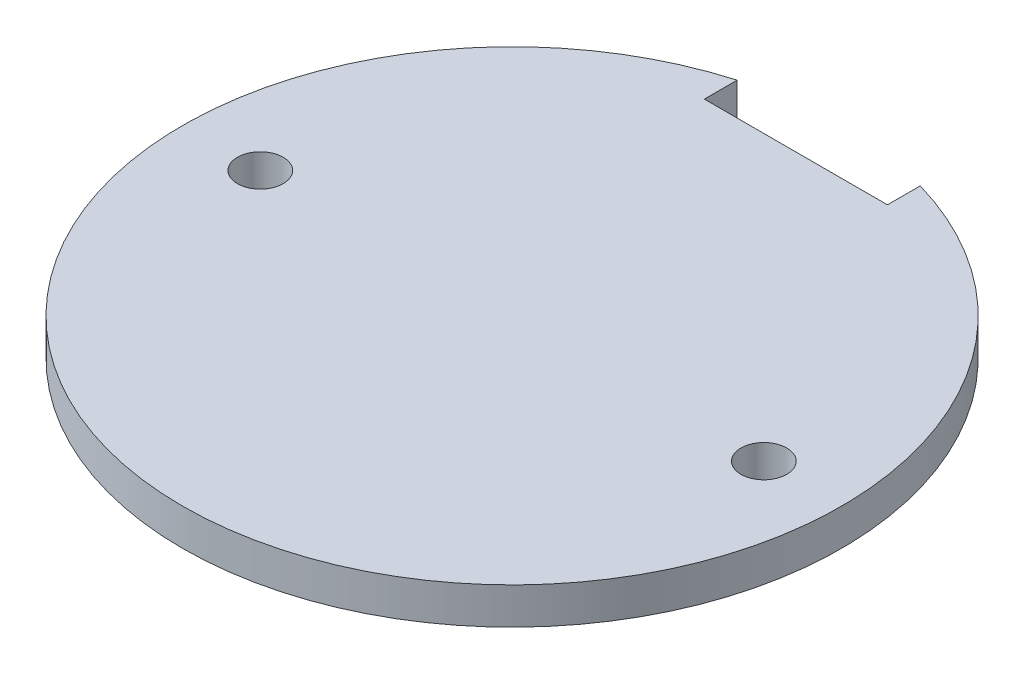
ISO-10303-21;
HEADER;
FILE_DESCRIPTION(('STEP AP214'),'2;1');
FILE_NAME('part.step','',(''),(''),'','','');
FILE_SCHEMA(('AUTOMOTIVE_DESIGN { 1 0 10303 214 1 1 1 1 }'));
ENDSEC;
DATA;
#1=APPLICATION_CONTEXT('core data for automotive mechanical design processes');
#2=APPLICATION_PROTOCOL_DEFINITION('international standard','automotive_design',2000,#1);
#3=PRODUCT_CONTEXT('',#1,'mechanical');
#4=PRODUCT('Part','Part','',(#3));
#5=PRODUCT_RELATED_PRODUCT_CATEGORY('part','',(#4));
#6=PRODUCT_DEFINITION_FORMATION('','',#4);
#7=PRODUCT_DEFINITION_CONTEXT('part definition',#1,'design');
#8=PRODUCT_DEFINITION('design','',#6,#7);
#9=PRODUCT_DEFINITION_SHAPE('','',#8);
#10=(LENGTH_UNIT() NAMED_UNIT(*) SI_UNIT(.MILLI.,.METRE.));
#11=(NAMED_UNIT(*) PLANE_ANGLE_UNIT() SI_UNIT($,.RADIAN.));
#12=(NAMED_UNIT(*) SI_UNIT($,.STERADIAN.) SOLID_ANGLE_UNIT());
#13=UNCERTAINTY_MEASURE_WITH_UNIT(LENGTH_MEASURE(1.E-05),#10,'distance_accuracy_value','');
#14=(GEOMETRIC_REPRESENTATION_CONTEXT(3) GLOBAL_UNCERTAINTY_ASSIGNED_CONTEXT((#13)) GLOBAL_UNIT_ASSIGNED_CONTEXT((#10,
#11,#12)) REPRESENTATION_CONTEXT('',''));
#15=CARTESIAN_POINT('',(0.,0.,0.));
#16=DIRECTION('',(0.,0.,1.));
#17=DIRECTION('',(1.,0.,0.));
#18=AXIS2_PLACEMENT_3D('',#15,#16,#17);
#19=CARTESIAN_POINT('',(0.,4.,0.));
#20=DIRECTION('',(0.,1.,0.));
#21=DIRECTION('',(0.,0.,1.));
#22=AXIS2_PLACEMENT_3D('',#19,#20,#21);
#23=PLANE('',#22);
#24=CARTESIAN_POINT('',(-27.5,4.,0.));
#25=DIRECTION('',(0.,1.,0.));
#26=DIRECTION('',(0.,0.,1.));
#27=AXIS2_PLACEMENT_3D('',#24,#25,#26);
#28=CIRCLE('',#27,2.5);
#29=CARTESIAN_POINT('',(-27.5,4.,2.5));
#30=VERTEX_POINT('',#29);
#31=EDGE_CURVE('E100',#30,#30,#28,.T.);
#32=ORIENTED_EDGE('',*,*,#31,.F.);
#33=EDGE_LOOP('',(#32));
#34=FACE_BOUND('',#33,.T.);
#35=CARTESIAN_POINT('',(0.,4.,0.));
#36=DIRECTION('',(0.,1.,0.));
#37=DIRECTION('',(0.,0.,1.));
#38=AXIS2_PLACEMENT_3D('',#35,#36,#37);
#39=CIRCLE('',#38,36.);
#40=CARTESIAN_POINT('',(-10.,4.,-34.5832329315812));
#41=VERTEX_POINT('',#40);
#42=CARTESIAN_POINT('',(10.,4.,-34.5832329315812));
#43=VERTEX_POINT('',#42);
#44=EDGE_CURVE('E85',#41,#43,#39,.T.);
#45=ORIENTED_EDGE('',*,*,#44,.T.);
#46=DIRECTION('',(0.,0.,1.));
#47=VECTOR('',#46,1.);
#48=CARTESIAN_POINT('',(10.,4.,-31.));
#49=LINE('',#48,#47);
#50=CARTESIAN_POINT('',(10.,4.,-31.));
#51=VERTEX_POINT('',#50);
#52=EDGE_CURVE('E80',#43,#51,#49,.T.);
#53=ORIENTED_EDGE('',*,*,#52,.T.);
#54=DIRECTION('',(-1.,0.,0.));
#55=VECTOR('',#54,1.);
#56=CARTESIAN_POINT('',(-10.,4.,-31.));
#57=LINE('',#56,#55);
#58=CARTESIAN_POINT('',(-10.,4.,-31.));
#59=VERTEX_POINT('',#58);
#60=EDGE_CURVE('E83',#51,#59,#57,.T.);
#61=ORIENTED_EDGE('',*,*,#60,.T.);
#62=DIRECTION('',(0.,0.,-1.));
#63=VECTOR('',#62,1.);
#64=CARTESIAN_POINT('',(-10.,4.,-34.5832329315812));
#65=LINE('',#64,#63);
#66=EDGE_CURVE('E50',#59,#41,#65,.T.);
#67=ORIENTED_EDGE('',*,*,#66,.T.);
#68=EDGE_LOOP('',(#45,#53,#61,#67));
#69=FACE_BOUND('',#68,.T.);
#70=CARTESIAN_POINT('',(27.5,4.,0.));
#71=DIRECTION('',(0.,1.,0.));
#72=DIRECTION('',(0.,0.,1.));
#73=AXIS2_PLACEMENT_3D('',#70,#71,#72);
#74=CIRCLE('',#73,2.5);
#75=CARTESIAN_POINT('',(27.5,4.,2.49999999999999));
#76=VERTEX_POINT('',#75);
#77=EDGE_CURVE('E115',#76,#76,#74,.T.);
#78=ORIENTED_EDGE('',*,*,#77,.F.);
#79=EDGE_LOOP('',(#78));
#80=FACE_BOUND('',#79,.T.);
#81=ADVANCED_FACE('F33',(#34,#69,#80),#23,.T.);
#82=CARTESIAN_POINT('',(0.,0.,0.));
#83=DIRECTION('',(0.,1.,0.));
#84=DIRECTION('',(0.,0.,1.));
#85=AXIS2_PLACEMENT_3D('',#82,#83,#84);
#86=PLANE('',#85);
#87=CARTESIAN_POINT('',(0.,0.,0.));
#88=DIRECTION('',(0.,1.,0.));
#89=DIRECTION('',(0.,0.,1.));
#90=AXIS2_PLACEMENT_3D('',#87,#88,#89);
#91=CIRCLE('',#90,36.);
#92=CARTESIAN_POINT('',(-10.,0.,-34.5832329315812));
#93=VERTEX_POINT('',#92);
#94=CARTESIAN_POINT('',(10.,0.,-34.5832329315812));
#95=VERTEX_POINT('',#94);
#96=EDGE_CURVE('E97',#93,#95,#91,.T.);
#97=ORIENTED_EDGE('',*,*,#96,.F.);
#98=DIRECTION('',(0.,0.,-1.));
#99=VECTOR('',#98,1.);
#100=CARTESIAN_POINT('',(-10.,0.,-34.5832329315812));
#101=LINE('',#100,#99);
#102=CARTESIAN_POINT('',(-10.,0.,-31.));
#103=VERTEX_POINT('',#102);
#104=EDGE_CURVE('E73',#103,#93,#101,.T.);
#105=ORIENTED_EDGE('',*,*,#104,.F.);
#106=DIRECTION('',(-1.,0.,0.));
#107=VECTOR('',#106,1.);
#108=CARTESIAN_POINT('',(-10.,0.,-31.));
#109=LINE('',#108,#107);
#110=CARTESIAN_POINT('',(10.,0.,-31.));
#111=VERTEX_POINT('',#110);
#112=EDGE_CURVE('E67',#111,#103,#109,.T.);
#113=ORIENTED_EDGE('',*,*,#112,.F.);
#114=DIRECTION('',(0.,0.,1.));
#115=VECTOR('',#114,1.);
#116=CARTESIAN_POINT('',(10.,0.,-31.));
#117=LINE('',#116,#115);
#118=EDGE_CURVE('E89',#95,#111,#117,.T.);
#119=ORIENTED_EDGE('',*,*,#118,.F.);
#120=EDGE_LOOP('',(#97,#105,#113,#119));
#121=FACE_BOUND('',#120,.T.);
#122=CARTESIAN_POINT('',(-27.5,0.,0.));
#123=DIRECTION('',(0.,1.,0.));
#124=DIRECTION('',(0.,0.,1.));
#125=AXIS2_PLACEMENT_3D('',#122,#123,#124);
#126=CIRCLE('',#125,2.5);
#127=CARTESIAN_POINT('',(-27.5,0.,2.5));
#128=VERTEX_POINT('',#127);
#129=EDGE_CURVE('E112',#128,#128,#126,.T.);
#130=ORIENTED_EDGE('',*,*,#129,.T.);
#131=EDGE_LOOP('',(#130));
#132=FACE_BOUND('',#131,.T.);
#133=CARTESIAN_POINT('',(27.5,0.,0.));
#134=DIRECTION('',(0.,1.,0.));
#135=DIRECTION('',(0.,0.,1.));
#136=AXIS2_PLACEMENT_3D('',#133,#134,#135);
#137=CIRCLE('',#136,2.5);
#138=CARTESIAN_POINT('',(27.5,0.,2.49999999999999));
#139=VERTEX_POINT('',#138);
#140=EDGE_CURVE('E118',#139,#139,#137,.T.);
#141=ORIENTED_EDGE('',*,*,#140,.T.);
#142=EDGE_LOOP('',(#141));
#143=FACE_BOUND('',#142,.T.);
#144=ADVANCED_FACE('F108',(#121,#132,#143),#86,.F.);
#145=CARTESIAN_POINT('',(0.,4.,0.));
#146=DIRECTION('',(0.,-1.,0.));
#147=DIRECTION('',(0.,0.,-1.));
#148=AXIS2_PLACEMENT_3D('',#145,#146,#147);
#149=CYLINDRICAL_SURFACE('',#148,36.);
#150=ORIENTED_EDGE('',*,*,#96,.T.);
#151=DIRECTION('',(0.,-1.,0.));
#152=VECTOR('',#151,1.);
#153=CARTESIAN_POINT('',(10.,4.,-34.5832329315812));
#154=LINE('',#153,#152);
#155=EDGE_CURVE('E11',#43,#95,#154,.T.);
#156=ORIENTED_EDGE('',*,*,#155,.F.);
#157=ORIENTED_EDGE('',*,*,#44,.F.);
#158=DIRECTION('',(0.,-1.,0.));
#159=VECTOR('',#158,1.);
#160=CARTESIAN_POINT('',(-10.,4.,-34.5832329315812));
#161=LINE('',#160,#159);
#162=EDGE_CURVE('E93',#41,#93,#161,.T.);
#163=ORIENTED_EDGE('',*,*,#162,.T.);
#164=EDGE_LOOP('',(#150,#156,#157,#163));
#165=FACE_BOUND('',#164,.T.);
#166=ADVANCED_FACE('F35',(#165),#149,.T.);
#167=CARTESIAN_POINT('',(10.,4.,-31.));
#168=DIRECTION('',(1.,0.,0.));
#169=DIRECTION('',(0.,0.,-1.));
#170=AXIS2_PLACEMENT_3D('',#167,#168,#169);
#171=PLANE('',#170);
#172=ORIENTED_EDGE('',*,*,#118,.T.);
#173=DIRECTION('',(0.,-1.,0.));
#174=VECTOR('',#173,1.);
#175=CARTESIAN_POINT('',(10.,4.,-31.));
#176=LINE('',#175,#174);
#177=EDGE_CURVE('E42',#51,#111,#176,.T.);
#178=ORIENTED_EDGE('',*,*,#177,.F.);
#179=ORIENTED_EDGE('',*,*,#52,.F.);
#180=ORIENTED_EDGE('',*,*,#155,.T.);
#181=EDGE_LOOP('',(#172,#178,#179,#180));
#182=FACE_BOUND('',#181,.T.);
#183=ADVANCED_FACE('F88',(#182),#171,.F.);
#184=CARTESIAN_POINT('',(-10.,4.,-31.));
#185=DIRECTION('',(0.,0.,1.));
#186=DIRECTION('',(1.,0.,0.));
#187=AXIS2_PLACEMENT_3D('',#184,#185,#186);
#188=PLANE('',#187);
#189=ORIENTED_EDGE('',*,*,#112,.T.);
#190=DIRECTION('',(0.,-1.,0.));
#191=VECTOR('',#190,1.);
#192=CARTESIAN_POINT('',(-10.,4.,-31.));
#193=LINE('',#192,#191);
#194=EDGE_CURVE('E90',#59,#103,#193,.T.);
#195=ORIENTED_EDGE('',*,*,#194,.F.);
#196=ORIENTED_EDGE('',*,*,#60,.F.);
#197=ORIENTED_EDGE('',*,*,#177,.T.);
#198=EDGE_LOOP('',(#189,#195,#196,#197));
#199=FACE_BOUND('',#198,.T.);
#200=ADVANCED_FACE('F91',(#199),#188,.F.);
#201=CARTESIAN_POINT('',(-10.,4.,-34.5832329315812));
#202=DIRECTION('',(-1.,0.,0.));
#203=DIRECTION('',(0.,0.,1.));
#204=AXIS2_PLACEMENT_3D('',#201,#202,#203);
#205=PLANE('',#204);
#206=ORIENTED_EDGE('',*,*,#104,.T.);
#207=ORIENTED_EDGE('',*,*,#162,.F.);
#208=ORIENTED_EDGE('',*,*,#66,.F.);
#209=ORIENTED_EDGE('',*,*,#194,.T.);
#210=EDGE_LOOP('',(#206,#207,#208,#209));
#211=FACE_BOUND('',#210,.T.);
#212=ADVANCED_FACE('F105',(#211),#205,.F.);
#213=CARTESIAN_POINT('',(-27.5,4.,0.));
#214=DIRECTION('',(0.,-1.,0.));
#215=DIRECTION('',(0.,0.,-1.));
#216=AXIS2_PLACEMENT_3D('',#213,#214,#215);
#217=CYLINDRICAL_SURFACE('',#216,2.5);
#218=ORIENTED_EDGE('',*,*,#31,.T.);
#219=EDGE_LOOP('',(#218));
#220=FACE_BOUND('',#219,.T.);
#221=ORIENTED_EDGE('',*,*,#129,.F.);
#222=EDGE_LOOP('',(#221));
#223=FACE_BOUND('',#222,.T.);
#224=ADVANCED_FACE('F135',(#220,#223),#217,.F.);
#225=CARTESIAN_POINT('',(27.5,4.,0.));
#226=DIRECTION('',(0.,-1.,0.));
#227=DIRECTION('',(0.,0.,-1.));
#228=AXIS2_PLACEMENT_3D('',#225,#226,#227);
#229=CYLINDRICAL_SURFACE('',#228,2.5);
#230=ORIENTED_EDGE('',*,*,#77,.T.);
#231=EDGE_LOOP('',(#230));
#232=FACE_BOUND('',#231,.T.);
#233=ORIENTED_EDGE('',*,*,#140,.F.);
#234=EDGE_LOOP('',(#233));
#235=FACE_BOUND('',#234,.T.);
#236=ADVANCED_FACE('F124',(#232,#235),#229,.F.);
#237=CLOSED_SHELL('',(#81,#144,#166,#183,#200,#212,#224,#236));
#238=MANIFOLD_SOLID_BREP('B2',#237);
#239=ADVANCED_BREP_SHAPE_REPRESENTATION('',(#18,#238),#14);
#240=SHAPE_DEFINITION_REPRESENTATION(#9,#239);
ENDSEC;
END-ISO-10303-21;
